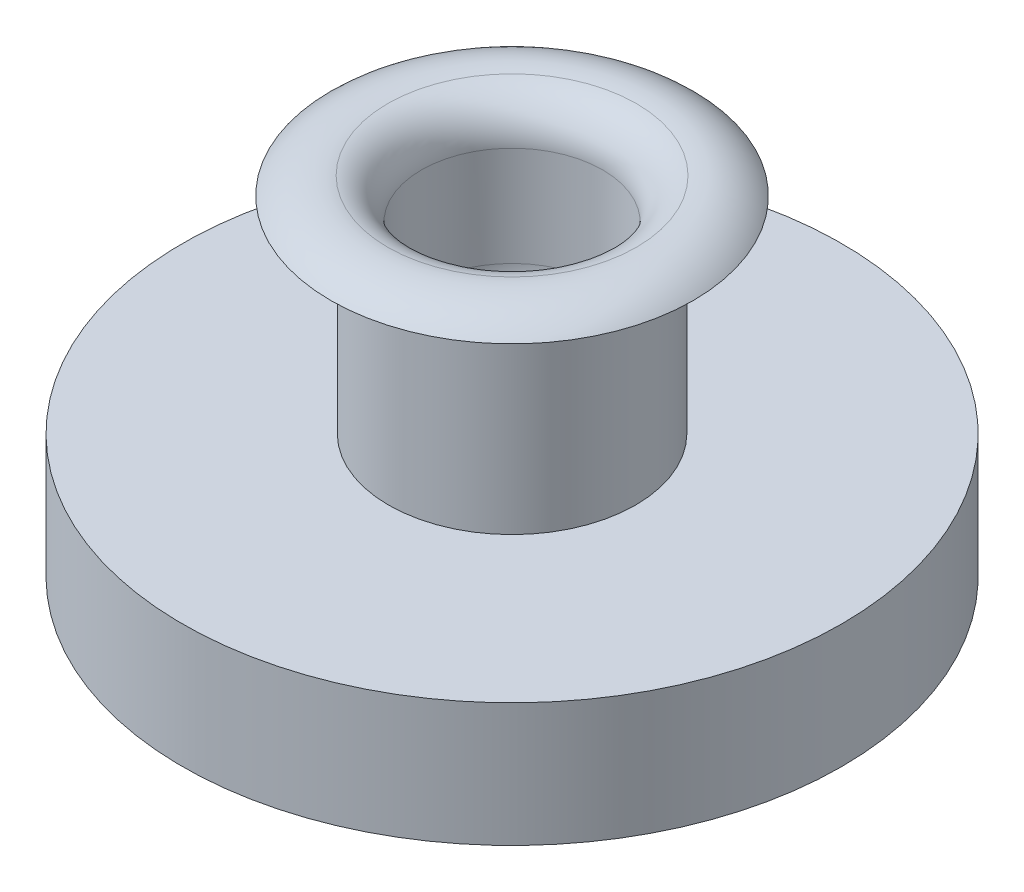
ISO-10303-21;
HEADER;
FILE_DESCRIPTION(('STEP AP214'),'2;1');
FILE_NAME('part.step','',(''),(''),'','','');
FILE_SCHEMA(('AUTOMOTIVE_DESIGN { 1 0 10303 214 1 1 1 1 }'));
ENDSEC;
DATA;
#1=APPLICATION_CONTEXT('core data for automotive mechanical design processes');
#2=APPLICATION_PROTOCOL_DEFINITION('international standard','automotive_design',2000,#1);
#3=PRODUCT_CONTEXT('',#1,'mechanical');
#4=PRODUCT('Part','Part','',(#3));
#5=PRODUCT_RELATED_PRODUCT_CATEGORY('part','',(#4));
#6=PRODUCT_DEFINITION_FORMATION('','',#4);
#7=PRODUCT_DEFINITION_CONTEXT('part definition',#1,'design');
#8=PRODUCT_DEFINITION('design','',#6,#7);
#9=PRODUCT_DEFINITION_SHAPE('','',#8);
#10=(LENGTH_UNIT() NAMED_UNIT(*) SI_UNIT(.MILLI.,.METRE.));
#11=(NAMED_UNIT(*) PLANE_ANGLE_UNIT() SI_UNIT($,.RADIAN.));
#12=(NAMED_UNIT(*) SI_UNIT($,.STERADIAN.) SOLID_ANGLE_UNIT());
#13=UNCERTAINTY_MEASURE_WITH_UNIT(LENGTH_MEASURE(1.E-05),#10,'distance_accuracy_value','');
#14=(GEOMETRIC_REPRESENTATION_CONTEXT(3) GLOBAL_UNCERTAINTY_ASSIGNED_CONTEXT((#13)) GLOBAL_UNIT_ASSIGNED_CONTEXT((#10,
#11,#12)) REPRESENTATION_CONTEXT('',''));
#15=CARTESIAN_POINT('',(0.,0.,0.));
#16=DIRECTION('',(0.,0.,1.));
#17=DIRECTION('',(1.,0.,0.));
#18=AXIS2_PLACEMENT_3D('',#15,#16,#17);
#19=CARTESIAN_POINT('',(0.,-1.5,0.));
#20=DIRECTION('',(0.,-1.,0.));
#21=DIRECTION('',(1.,0.,0.));
#22=AXIS2_PLACEMENT_3D('',#19,#20,#21);
#23=CYLINDRICAL_SURFACE('',#22,1.5);
#24=CARTESIAN_POINT('',(0.,-1.50000000000001,0.));
#25=DIRECTION('',(0.,-1.,0.));
#26=DIRECTION('',(1.,0.,0.));
#27=AXIS2_PLACEMENT_3D('',#24,#25,#26);
#28=CIRCLE('',#27,1.49999999999999);
#29=CARTESIAN_POINT('',(1.49999999999998,-1.50000000000001,0.));
#30=VERTEX_POINT('',#29);
#31=EDGE_CURVE('E87',#30,#30,#28,.T.);
#32=ORIENTED_EDGE('',*,*,#31,.F.);
#33=EDGE_LOOP('',(#32));
#34=FACE_BOUND('',#33,.T.);
#35=CARTESIAN_POINT('',(0.,0.999999999999994,0.));
#36=DIRECTION('',(0.,-1.,0.));
#37=DIRECTION('',(1.,0.,0.));
#38=AXIS2_PLACEMENT_3D('',#35,#36,#37);
#39=CIRCLE('',#38,1.5);
#40=CARTESIAN_POINT('',(1.5,0.999999999999988,0.));
#41=VERTEX_POINT('',#40);
#42=EDGE_CURVE('E83',#41,#41,#39,.T.);
#43=ORIENTED_EDGE('',*,*,#42,.T.);
#44=EDGE_LOOP('',(#43));
#45=FACE_BOUND('',#44,.T.);
#46=ADVANCED_FACE('F34',(#34,#45),#23,.T.);
#47=CARTESIAN_POINT('',(-1.5,0.999999999999999,0.));
#48=DIRECTION('',(0.,1.,0.));
#49=DIRECTION('',(-1.,0.,0.));
#50=AXIS2_PLACEMENT_3D('',#47,#48,#49);
#51=PLANE('',#50);
#52=ORIENTED_EDGE('',*,*,#42,.F.);
#53=EDGE_LOOP('',(#52));
#54=FACE_BOUND('',#53,.T.);
#55=CARTESIAN_POINT('',(0.,0.999999999999991,0.));
#56=DIRECTION('',(0.,-1.,0.));
#57=DIRECTION('',(1.,0.,0.));
#58=AXIS2_PLACEMENT_3D('',#55,#56,#57);
#59=CIRCLE('',#58,2.2);
#60=CARTESIAN_POINT('',(2.2,0.999999999999983,0.));
#61=VERTEX_POINT('',#60);
#62=EDGE_CURVE('E81',#61,#61,#59,.T.);
#63=ORIENTED_EDGE('',*,*,#62,.T.);
#64=EDGE_LOOP('',(#63));
#65=FACE_BOUND('',#64,.T.);
#66=ADVANCED_FACE('F61',(#54,#65),#51,.F.);
#67=CARTESIAN_POINT('',(0.,0.449512890789924,0.));
#68=DIRECTION('',(0.,-1.,0.));
#69=DIRECTION('',(1.,0.,0.));
#70=AXIS2_PLACEMENT_3D('',#67,#68,#69);
#71=TOROIDAL_SURFACE('',#70,1.65,0.778161973760257);
#72=CARTESIAN_POINT('',(0.,1.21500021796988,0.));
#73=DIRECTION('',(0.,-1.,0.));
#74=DIRECTION('',(1.,0.,0.));
#75=AXIS2_PLACEMENT_3D('',#72,#73,#74);
#76=CIRCLE('',#75,1.51012430756783);
#77=CARTESIAN_POINT('',(1.51012430756783,1.21500021796987,0.));
#78=VERTEX_POINT('',#77);
#79=EDGE_CURVE('E41',#78,#78,#76,.T.);
#80=ORIENTED_EDGE('',*,*,#79,.T.);
#81=EDGE_LOOP('',(#80));
#82=FACE_BOUND('',#81,.T.);
#83=ORIENTED_EDGE('',*,*,#62,.F.);
#84=EDGE_LOOP('',(#83));
#85=FACE_BOUND('',#84,.T.);
#86=ADVANCED_FACE('F55',(#82,#85),#71,.T.);
#87=CARTESIAN_POINT('',(0.,-1.5,0.));
#88=DIRECTION('',(0.,-1.,0.));
#89=DIRECTION('',(1.,0.,0.));
#90=AXIS2_PLACEMENT_3D('',#87,#88,#89);
#91=CYLINDRICAL_SURFACE('',#90,1.1);
#92=CARTESIAN_POINT('',(0.,0.723144182213624,0.));
#93=DIRECTION('',(0.,1.,0.));
#94=DIRECTION('',(-1.,0.,0.));
#95=AXIS2_PLACEMENT_3D('',#92,#93,#94);
#96=CIRCLE('',#95,1.1);
#97=CARTESIAN_POINT('',(-1.1,0.723144182213628,0.));
#98=VERTEX_POINT('',#97);
#99=EDGE_CURVE('E11',#98,#98,#96,.T.);
#100=ORIENTED_EDGE('',*,*,#99,.T.);
#101=EDGE_LOOP('',(#100));
#102=FACE_BOUND('',#101,.T.);
#103=CARTESIAN_POINT('',(0.,-0.48806573090466,0.));
#104=DIRECTION('',(0.,-1.,0.));
#105=DIRECTION('',(1.,0.,0.));
#106=AXIS2_PLACEMENT_3D('',#103,#104,#105);
#107=CIRCLE('',#106,1.1);
#108=CARTESIAN_POINT('',(1.09999999999999,-0.488065730904665,0.));
#109=VERTEX_POINT('',#108);
#110=EDGE_CURVE('E96',#109,#109,#107,.T.);
#111=ORIENTED_EDGE('',*,*,#110,.T.);
#112=EDGE_LOOP('',(#111));
#113=FACE_BOUND('',#112,.T.);
#114=ADVANCED_FACE('F47',(#102,#113),#91,.F.);
#115=CARTESIAN_POINT('',(0.,-1.34120953580275,0.));
#116=DIRECTION('',(0.,1.,0.));
#117=DIRECTION('',(-1.,0.,0.));
#118=AXIS2_PLACEMENT_3D('',#115,#116,#117);
#119=CONICAL_SURFACE('',#118,0.,1.42379335263982);
#120=CARTESIAN_POINT('',(0.,-1.27943733615441,0.));
#121=DIRECTION('',(0.,1.,0.));
#122=DIRECTION('',(-1.,0.,0.));
#123=AXIS2_PLACEMENT_3D('',#120,#121,#122);
#124=CIRCLE('',#123,0.417179274636924);
#125=CARTESIAN_POINT('',(-0.417179274636933,-1.27943733615441,0.));
#126=VERTEX_POINT('',#125);
#127=EDGE_CURVE('E99',#126,#126,#124,.T.);
#128=ORIENTED_EDGE('',*,*,#127,.T.);
#129=EDGE_LOOP('',(#128));
#130=FACE_BOUND('',#129,.T.);
#131=CARTESIAN_POINT('',(0.,-1.34120953580275,0.));
#132=VERTEX_POINT('',#131);
#133=VERTEX_LOOP('',#132);
#134=FACE_BOUND('',#133,.T.);
#135=ADVANCED_FACE('F44',(#130,#134),#119,.F.);
#136=CARTESIAN_POINT('',(0.,-0.48806573090466,0.));
#137=DIRECTION('',(0.,-1.,0.));
#138=DIRECTION('',(1.,0.,0.));
#139=AXIS2_PLACEMENT_3D('',#136,#137,#138);
#140=DEGENERATE_TOROIDAL_SURFACE('',#139,0.299999999999996,0.8,.T.);
#141=ORIENTED_EDGE('',*,*,#127,.F.);
#142=EDGE_LOOP('',(#141));
#143=FACE_BOUND('',#142,.T.);
#144=ORIENTED_EDGE('',*,*,#110,.F.);
#145=EDGE_LOOP('',(#144));
#146=FACE_BOUND('',#145,.T.);
#147=ADVANCED_FACE('F46',(#143,#146),#140,.F.);
#148=CARTESIAN_POINT('',(0.,0.723144182213624,0.));
#149=DIRECTION('',(0.,1.,0.));
#150=DIRECTION('',(-1.,0.,0.));
#151=AXIS2_PLACEMENT_3D('',#148,#149,#150);
#152=TOROIDAL_SURFACE('',#151,1.6,0.5);
#153=ORIENTED_EDGE('',*,*,#99,.F.);
#154=EDGE_LOOP('',(#153));
#155=FACE_BOUND('',#154,.T.);
#156=ORIENTED_EDGE('',*,*,#79,.F.);
#157=EDGE_LOOP('',(#156));
#158=FACE_BOUND('',#157,.T.);
#159=ADVANCED_FACE('F36',(#155,#158),#152,.T.);
#160=CARTESIAN_POINT('',(0.,-3.,0.));
#161=DIRECTION('',(0.,1.,0.));
#162=DIRECTION('',(-1.,0.,0.));
#163=AXIS2_PLACEMENT_3D('',#160,#161,#162);
#164=CYLINDRICAL_SURFACE('',#163,4.);
#165=CARTESIAN_POINT('',(0.,-3.,0.));
#166=DIRECTION('',(0.,-1.,0.));
#167=DIRECTION('',(1.,0.,0.));
#168=AXIS2_PLACEMENT_3D('',#165,#166,#167);
#169=CIRCLE('',#168,4.);
#170=CARTESIAN_POINT('',(3.99999999999999,-3.00000000000002,0.));
#171=VERTEX_POINT('',#170);
#172=EDGE_CURVE('E84',#171,#171,#169,.T.);
#173=ORIENTED_EDGE('',*,*,#172,.F.);
#174=EDGE_LOOP('',(#173));
#175=FACE_BOUND('',#174,.T.);
#176=CARTESIAN_POINT('',(0.,-1.5,0.));
#177=DIRECTION('',(0.,-1.,0.));
#178=DIRECTION('',(1.,0.,0.));
#179=AXIS2_PLACEMENT_3D('',#176,#177,#178);
#180=CIRCLE('',#179,4.);
#181=CARTESIAN_POINT('',(3.99999999999999,-1.50000000000002,0.));
#182=VERTEX_POINT('',#181);
#183=EDGE_CURVE('E90',#182,#182,#180,.T.);
#184=ORIENTED_EDGE('',*,*,#183,.T.);
#185=EDGE_LOOP('',(#184));
#186=FACE_BOUND('',#185,.T.);
#187=ADVANCED_FACE('F113',(#175,#186),#164,.T.);
#188=CARTESIAN_POINT('',(0.,-3.,0.));
#189=DIRECTION('',(0.,-1.,0.));
#190=DIRECTION('',(1.,0.,0.));
#191=AXIS2_PLACEMENT_3D('',#188,#189,#190);
#192=PLANE('',#191);
#193=ORIENTED_EDGE('',*,*,#172,.T.);
#194=EDGE_LOOP('',(#193));
#195=FACE_BOUND('',#194,.T.);
#196=ADVANCED_FACE('F108',(#195),#192,.T.);
#197=CARTESIAN_POINT('',(0.,-1.5,0.));
#198=DIRECTION('',(0.,-1.,0.));
#199=DIRECTION('',(1.,0.,0.));
#200=AXIS2_PLACEMENT_3D('',#197,#198,#199);
#201=PLANE('',#200);
#202=ORIENTED_EDGE('',*,*,#31,.T.);
#203=EDGE_LOOP('',(#202));
#204=FACE_BOUND('',#203,.T.);
#205=ORIENTED_EDGE('',*,*,#183,.F.);
#206=EDGE_LOOP('',(#205));
#207=FACE_BOUND('',#206,.T.);
#208=ADVANCED_FACE('F105',(#204,#207),#201,.F.);
#209=CLOSED_SHELL('',(#46,#66,#86,#114,#135,#147,#159,#187,#196,#208));
#210=MANIFOLD_SOLID_BREP('B2',#209);
#211=ADVANCED_BREP_SHAPE_REPRESENTATION('',(#18,#210),#14);
#212=SHAPE_DEFINITION_REPRESENTATION(#9,#211);
ENDSEC;
END-ISO-10303-21;
